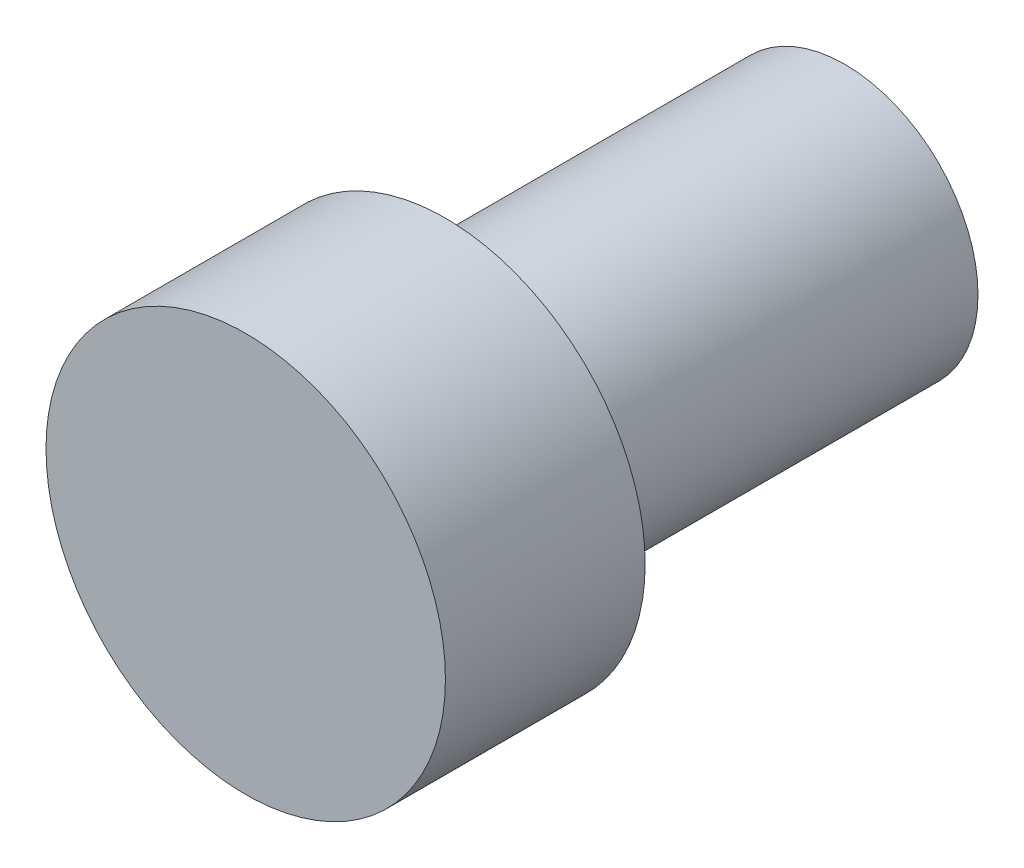
ISO-10303-21;
HEADER;
FILE_DESCRIPTION(('STEP AP214'),'2;1');
FILE_NAME('part.step','',(''),(''),'','','');
FILE_SCHEMA(('AUTOMOTIVE_DESIGN { 1 0 10303 214 1 1 1 1 }'));
ENDSEC;
DATA;
#1=APPLICATION_CONTEXT('core data for automotive mechanical design processes');
#2=APPLICATION_PROTOCOL_DEFINITION('international standard','automotive_design',2000,#1);
#3=PRODUCT_CONTEXT('',#1,'mechanical');
#4=PRODUCT('Part','Part','',(#3));
#5=PRODUCT_RELATED_PRODUCT_CATEGORY('part','',(#4));
#6=PRODUCT_DEFINITION_FORMATION('','',#4);
#7=PRODUCT_DEFINITION_CONTEXT('part definition',#1,'design');
#8=PRODUCT_DEFINITION('design','',#6,#7);
#9=PRODUCT_DEFINITION_SHAPE('','',#8);
#10=(LENGTH_UNIT() NAMED_UNIT(*) SI_UNIT(.MILLI.,.METRE.));
#11=(NAMED_UNIT(*) PLANE_ANGLE_UNIT() SI_UNIT($,.RADIAN.));
#12=(NAMED_UNIT(*) SI_UNIT($,.STERADIAN.) SOLID_ANGLE_UNIT());
#13=UNCERTAINTY_MEASURE_WITH_UNIT(LENGTH_MEASURE(1.E-05),#10,'distance_accuracy_value','');
#14=(GEOMETRIC_REPRESENTATION_CONTEXT(3) GLOBAL_UNCERTAINTY_ASSIGNED_CONTEXT((#13)) GLOBAL_UNIT_ASSIGNED_CONTEXT((#10,
#11,#12)) REPRESENTATION_CONTEXT('',''));
#15=CARTESIAN_POINT('',(0.,0.,0.));
#16=DIRECTION('',(0.,0.,1.));
#17=DIRECTION('',(1.,0.,0.));
#18=AXIS2_PLACEMENT_3D('',#15,#16,#17);
#19=CARTESIAN_POINT('',(0.,0.,6.));
#20=DIRECTION('',(0.,0.,-1.));
#21=DIRECTION('',(-1.,0.,0.));
#22=AXIS2_PLACEMENT_3D('',#19,#20,#21);
#23=CYLINDRICAL_SURFACE('',#22,2.);
#24=CARTESIAN_POINT('',(0.,0.,6.));
#25=DIRECTION('',(0.,0.,1.));
#26=DIRECTION('',(1.,0.,0.));
#27=AXIS2_PLACEMENT_3D('',#24,#25,#26);
#28=CIRCLE('',#27,2.);
#29=CARTESIAN_POINT('',(2.,0.,6.));
#30=VERTEX_POINT('',#29);
#31=EDGE_CURVE('E10',#30,#30,#28,.T.);
#32=ORIENTED_EDGE('',*,*,#31,.F.);
#33=EDGE_LOOP('',(#32));
#34=FACE_BOUND('',#33,.T.);
#35=CARTESIAN_POINT('',(0.,0.,0.));
#36=DIRECTION('',(0.,0.,1.));
#37=DIRECTION('',(1.,0.,0.));
#38=AXIS2_PLACEMENT_3D('',#35,#36,#37);
#39=CIRCLE('',#38,2.);
#40=CARTESIAN_POINT('',(2.,0.,0.));
#41=VERTEX_POINT('',#40);
#42=EDGE_CURVE('E37',#41,#41,#39,.T.);
#43=ORIENTED_EDGE('',*,*,#42,.T.);
#44=EDGE_LOOP('',(#43));
#45=FACE_BOUND('',#44,.T.);
#46=ADVANCED_FACE('F34',(#34,#45),#23,.T.);
#47=CARTESIAN_POINT('',(0.,0.,0.));
#48=DIRECTION('',(0.,0.,1.));
#49=DIRECTION('',(1.,0.,0.));
#50=AXIS2_PLACEMENT_3D('',#47,#48,#49);
#51=PLANE('',#50);
#52=ORIENTED_EDGE('',*,*,#42,.F.);
#53=EDGE_LOOP('',(#52));
#54=FACE_BOUND('',#53,.T.);
#55=ADVANCED_FACE('F57',(#54),#51,.F.);
#56=CARTESIAN_POINT('',(0.,0.,9.));
#57=DIRECTION('',(0.,0.,-1.));
#58=DIRECTION('',(-1.,0.,0.));
#59=AXIS2_PLACEMENT_3D('',#56,#57,#58);
#60=CYLINDRICAL_SURFACE('',#59,3.);
#61=CARTESIAN_POINT('',(0.,0.,9.));
#62=DIRECTION('',(0.,0.,1.));
#63=DIRECTION('',(1.,0.,0.));
#64=AXIS2_PLACEMENT_3D('',#61,#62,#63);
#65=CIRCLE('',#64,3.);
#66=CARTESIAN_POINT('',(3.,0.,9.));
#67=VERTEX_POINT('',#66);
#68=EDGE_CURVE('E44',#67,#67,#65,.T.);
#69=ORIENTED_EDGE('',*,*,#68,.F.);
#70=EDGE_LOOP('',(#69));
#71=FACE_BOUND('',#70,.T.);
#72=CARTESIAN_POINT('',(0.,0.,6.));
#73=DIRECTION('',(0.,0.,1.));
#74=DIRECTION('',(1.,0.,0.));
#75=AXIS2_PLACEMENT_3D('',#72,#73,#74);
#76=CIRCLE('',#75,3.);
#77=CARTESIAN_POINT('',(3.,0.,6.));
#78=VERTEX_POINT('',#77);
#79=EDGE_CURVE('E46',#78,#78,#76,.T.);
#80=ORIENTED_EDGE('',*,*,#79,.T.);
#81=EDGE_LOOP('',(#80));
#82=FACE_BOUND('',#81,.T.);
#83=ADVANCED_FACE('F54',(#71,#82),#60,.T.);
#84=CARTESIAN_POINT('',(0.,0.,9.));
#85=DIRECTION('',(0.,0.,1.));
#86=DIRECTION('',(1.,0.,0.));
#87=AXIS2_PLACEMENT_3D('',#84,#85,#86);
#88=PLANE('',#87);
#89=ORIENTED_EDGE('',*,*,#68,.T.);
#90=EDGE_LOOP('',(#89));
#91=FACE_BOUND('',#90,.T.);
#92=ADVANCED_FACE('F52',(#91),#88,.T.);
#93=CARTESIAN_POINT('',(0.,0.,6.));
#94=DIRECTION('',(0.,0.,1.));
#95=DIRECTION('',(1.,0.,0.));
#96=AXIS2_PLACEMENT_3D('',#93,#94,#95);
#97=PLANE('',#96);
#98=ORIENTED_EDGE('',*,*,#31,.T.);
#99=EDGE_LOOP('',(#98));
#100=FACE_BOUND('',#99,.T.);
#101=ORIENTED_EDGE('',*,*,#79,.F.);
#102=EDGE_LOOP('',(#101));
#103=FACE_BOUND('',#102,.T.);
#104=ADVANCED_FACE('F61',(#100,#103),#97,.F.);
#105=CLOSED_SHELL('',(#46,#55,#83,#92,#104));
#106=MANIFOLD_SOLID_BREP('B2',#105);
#107=ADVANCED_BREP_SHAPE_REPRESENTATION('',(#18,#106),#14);
#108=SHAPE_DEFINITION_REPRESENTATION(#9,#107);
ENDSEC;
END-ISO-10303-21;
